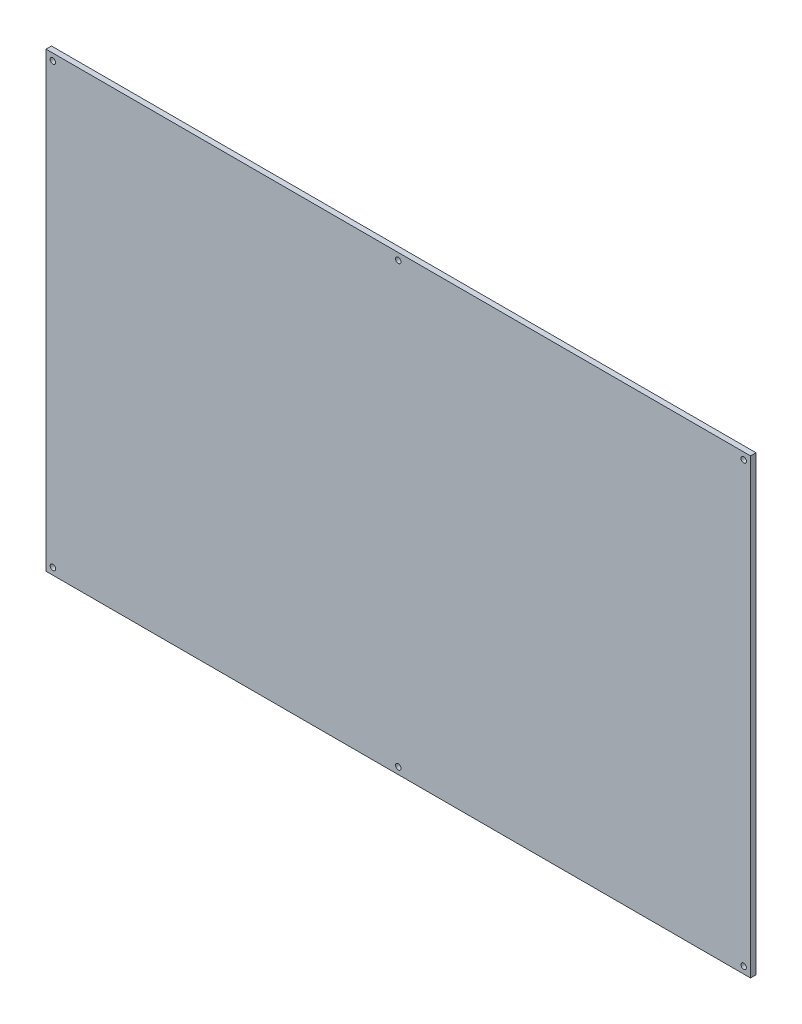
ISO-10303-21;
HEADER;
FILE_DESCRIPTION(('STEP AP214'),'2;1');
FILE_NAME('part.step','',(''),(''),'','','');
FILE_SCHEMA(('AUTOMOTIVE_DESIGN { 1 0 10303 214 1 1 1 1 }'));
ENDSEC;
DATA;
#1=APPLICATION_CONTEXT('core data for automotive mechanical design processes');
#2=APPLICATION_PROTOCOL_DEFINITION('international standard','automotive_design',2000,#1);
#3=PRODUCT_CONTEXT('',#1,'mechanical');
#4=PRODUCT('Part','Part','',(#3));
#5=PRODUCT_RELATED_PRODUCT_CATEGORY('part','',(#4));
#6=PRODUCT_DEFINITION_FORMATION('','',#4);
#7=PRODUCT_DEFINITION_CONTEXT('part definition',#1,'design');
#8=PRODUCT_DEFINITION('design','',#6,#7);
#9=PRODUCT_DEFINITION_SHAPE('','',#8);
#10=(LENGTH_UNIT() NAMED_UNIT(*) SI_UNIT(.MILLI.,.METRE.));
#11=(NAMED_UNIT(*) PLANE_ANGLE_UNIT() SI_UNIT($,.RADIAN.));
#12=(NAMED_UNIT(*) SI_UNIT($,.STERADIAN.) SOLID_ANGLE_UNIT());
#13=UNCERTAINTY_MEASURE_WITH_UNIT(LENGTH_MEASURE(1.E-05),#10,'distance_accuracy_value','');
#14=(GEOMETRIC_REPRESENTATION_CONTEXT(3) GLOBAL_UNCERTAINTY_ASSIGNED_CONTEXT((#13)) GLOBAL_UNIT_ASSIGNED_CONTEXT((#10,
#11,#12)) REPRESENTATION_CONTEXT('',''));
#15=CARTESIAN_POINT('',(0.,0.,0.));
#16=DIRECTION('',(0.,0.,1.));
#17=DIRECTION('',(1.,0.,0.));
#18=AXIS2_PLACEMENT_3D('',#15,#16,#17);
#19=CARTESIAN_POINT('',(0.,0.,2.));
#20=DIRECTION('',(0.,0.,1.));
#21=DIRECTION('',(1.,0.,0.));
#22=AXIS2_PLACEMENT_3D('',#19,#20,#21);
#23=PLANE('',#22);
#24=CARTESIAN_POINT('',(59.385498411727,-129.568493909192,2.));
#25=DIRECTION('',(0.,0.,1.));
#26=DIRECTION('',(1.,0.,0.));
#27=AXIS2_PLACEMENT_3D('',#24,#25,#26);
#28=CIRCLE('',#27,0.999999999999998);
#29=CARTESIAN_POINT('',(60.385498411727,-129.568493909192,2.));
#30=VERTEX_POINT('',#29);
#31=EDGE_CURVE('E132',#30,#30,#28,.T.);
#32=ORIENTED_EDGE('',*,*,#31,.F.);
#33=EDGE_LOOP('',(#32));
#34=FACE_BOUND('',#33,.T.);
#35=CARTESIAN_POINT('',(186.115498411727,31.3315060908084,2.));
#36=DIRECTION('',(0.,0.,1.));
#37=DIRECTION('',(1.,0.,0.));
#38=AXIS2_PLACEMENT_3D('',#35,#36,#37);
#39=CIRCLE('',#38,0.999999999999998);
#40=CARTESIAN_POINT('',(187.115498411727,31.3315060908084,2.));
#41=VERTEX_POINT('',#40);
#42=EDGE_CURVE('E120',#41,#41,#39,.T.);
#43=ORIENTED_EDGE('',*,*,#42,.F.);
#44=EDGE_LOOP('',(#43));
#45=FACE_BOUND('',#44,.T.);
#46=CARTESIAN_POINT('',(-67.334501588273,31.3315060908084,2.));
#47=DIRECTION('',(0.,0.,1.));
#48=DIRECTION('',(1.,0.,0.));
#49=AXIS2_PLACEMENT_3D('',#46,#47,#48);
#50=CIRCLE('',#49,0.999999999999998);
#51=CARTESIAN_POINT('',(-66.334501588273,31.3315060908084,2.));
#52=VERTEX_POINT('',#51);
#53=EDGE_CURVE('E99',#52,#52,#50,.T.);
#54=ORIENTED_EDGE('',*,*,#53,.F.);
#55=EDGE_LOOP('',(#54));
#56=FACE_BOUND('',#55,.T.);
#57=DIRECTION('',(0.,-1.,0.));
#58=VECTOR('',#57,1.);
#59=CARTESIAN_POINT('',(-69.834501588273,33.8315060908084,2.));
#60=LINE('',#59,#58);
#61=CARTESIAN_POINT('',(-69.834501588273,33.8315060908084,2.));
#62=VERTEX_POINT('',#61);
#63=CARTESIAN_POINT('',(-69.834501588273,-132.068493909192,2.));
#64=VERTEX_POINT('',#63);
#65=EDGE_CURVE('E84',#62,#64,#60,.T.);
#66=ORIENTED_EDGE('',*,*,#65,.T.);
#67=DIRECTION('',(1.,0.,0.));
#68=VECTOR('',#67,1.);
#69=CARTESIAN_POINT('',(-69.834501588273,-132.068493909192,2.));
#70=LINE('',#69,#68);
#71=CARTESIAN_POINT('',(188.615498411727,-132.068493909192,2.));
#72=VERTEX_POINT('',#71);
#73=EDGE_CURVE('E79',#64,#72,#70,.T.);
#74=ORIENTED_EDGE('',*,*,#73,.T.);
#75=DIRECTION('',(0.,1.,0.));
#76=VECTOR('',#75,1.);
#77=CARTESIAN_POINT('',(188.615498411727,33.8315060908084,2.));
#78=LINE('',#77,#76);
#79=CARTESIAN_POINT('',(188.615498411727,33.8315060908084,2.));
#80=VERTEX_POINT('',#79);
#81=EDGE_CURVE('E82',#72,#80,#78,.T.);
#82=ORIENTED_EDGE('',*,*,#81,.T.);
#83=DIRECTION('',(-1.,0.,0.));
#84=VECTOR('',#83,1.);
#85=CARTESIAN_POINT('',(-69.834501588273,33.8315060908084,2.));
#86=LINE('',#85,#84);
#87=EDGE_CURVE('E49',#80,#62,#86,.T.);
#88=ORIENTED_EDGE('',*,*,#87,.T.);
#89=EDGE_LOOP('',(#66,#74,#82,#88));
#90=FACE_BOUND('',#89,.T.);
#91=CARTESIAN_POINT('',(59.385498411727,31.3315060908084,2.));
#92=DIRECTION('',(0.,0.,1.));
#93=DIRECTION('',(1.,0.,0.));
#94=AXIS2_PLACEMENT_3D('',#91,#92,#93);
#95=CIRCLE('',#94,0.999999999999998);
#96=CARTESIAN_POINT('',(60.385498411727,31.3315060908084,2.));
#97=VERTEX_POINT('',#96);
#98=EDGE_CURVE('E114',#97,#97,#95,.T.);
#99=ORIENTED_EDGE('',*,*,#98,.F.);
#100=EDGE_LOOP('',(#99));
#101=FACE_BOUND('',#100,.T.);
#102=CARTESIAN_POINT('',(-67.334501588273,-129.568493909192,2.));
#103=DIRECTION('',(0.,0.,1.));
#104=DIRECTION('',(1.,0.,0.));
#105=AXIS2_PLACEMENT_3D('',#102,#103,#104);
#106=CIRCLE('',#105,0.999999999999998);
#107=CARTESIAN_POINT('',(-66.334501588273,-129.568493909192,2.));
#108=VERTEX_POINT('',#107);
#109=EDGE_CURVE('E126',#108,#108,#106,.T.);
#110=ORIENTED_EDGE('',*,*,#109,.F.);
#111=EDGE_LOOP('',(#110));
#112=FACE_BOUND('',#111,.T.);
#113=CARTESIAN_POINT('',(186.115498411727,-129.568493909192,2.));
#114=DIRECTION('',(0.,0.,1.));
#115=DIRECTION('',(1.,0.,0.));
#116=AXIS2_PLACEMENT_3D('',#113,#114,#115);
#117=CIRCLE('',#116,0.999999999999998);
#118=CARTESIAN_POINT('',(187.115498411727,-129.568493909192,2.));
#119=VERTEX_POINT('',#118);
#120=EDGE_CURVE('E138',#119,#119,#117,.T.);
#121=ORIENTED_EDGE('',*,*,#120,.F.);
#122=EDGE_LOOP('',(#121));
#123=FACE_BOUND('',#122,.T.);
#124=ADVANCED_FACE('F32',(#34,#45,#56,#90,#101,#112,#123),#23,.T.);
#125=CARTESIAN_POINT('',(0.,0.,0.));
#126=DIRECTION('',(0.,0.,1.));
#127=DIRECTION('',(1.,0.,0.));
#128=AXIS2_PLACEMENT_3D('',#125,#126,#127);
#129=PLANE('',#128);
#130=CARTESIAN_POINT('',(59.385498411727,-129.568493909192,0.));
#131=DIRECTION('',(0.,0.,1.));
#132=DIRECTION('',(1.,0.,0.));
#133=AXIS2_PLACEMENT_3D('',#130,#131,#132);
#134=CIRCLE('',#133,0.999999999999998);
#135=CARTESIAN_POINT('',(60.385498411727,-129.568493909192,0.));
#136=VERTEX_POINT('',#135);
#137=EDGE_CURVE('E135',#136,#136,#134,.T.);
#138=ORIENTED_EDGE('',*,*,#137,.T.);
#139=EDGE_LOOP('',(#138));
#140=FACE_BOUND('',#139,.T.);
#141=CARTESIAN_POINT('',(186.115498411727,31.3315060908084,0.));
#142=DIRECTION('',(0.,0.,1.));
#143=DIRECTION('',(1.,0.,0.));
#144=AXIS2_PLACEMENT_3D('',#141,#142,#143);
#145=CIRCLE('',#144,0.999999999999998);
#146=CARTESIAN_POINT('',(187.115498411727,31.3315060908084,0.));
#147=VERTEX_POINT('',#146);
#148=EDGE_CURVE('E123',#147,#147,#145,.T.);
#149=ORIENTED_EDGE('',*,*,#148,.T.);
#150=EDGE_LOOP('',(#149));
#151=FACE_BOUND('',#150,.T.);
#152=CARTESIAN_POINT('',(-67.334501588273,31.3315060908084,0.));
#153=DIRECTION('',(0.,0.,1.));
#154=DIRECTION('',(1.,0.,0.));
#155=AXIS2_PLACEMENT_3D('',#152,#153,#154);
#156=CIRCLE('',#155,0.999999999999998);
#157=CARTESIAN_POINT('',(-66.334501588273,31.3315060908084,0.));
#158=VERTEX_POINT('',#157);
#159=EDGE_CURVE('E111',#158,#158,#156,.T.);
#160=ORIENTED_EDGE('',*,*,#159,.T.);
#161=EDGE_LOOP('',(#160));
#162=FACE_BOUND('',#161,.T.);
#163=DIRECTION('',(0.,-1.,0.));
#164=VECTOR('',#163,1.);
#165=CARTESIAN_POINT('',(-69.834501588273,33.8315060908084,0.));
#166=LINE('',#165,#164);
#167=CARTESIAN_POINT('',(-69.834501588273,33.8315060908084,0.));
#168=VERTEX_POINT('',#167);
#169=CARTESIAN_POINT('',(-69.834501588273,-132.068493909192,0.));
#170=VERTEX_POINT('',#169);
#171=EDGE_CURVE('E96',#168,#170,#166,.T.);
#172=ORIENTED_EDGE('',*,*,#171,.F.);
#173=DIRECTION('',(-1.,0.,0.));
#174=VECTOR('',#173,1.);
#175=CARTESIAN_POINT('',(-69.834501588273,33.8315060908084,0.));
#176=LINE('',#175,#174);
#177=CARTESIAN_POINT('',(188.615498411727,33.8315060908084,0.));
#178=VERTEX_POINT('',#177);
#179=EDGE_CURVE('E72',#178,#168,#176,.T.);
#180=ORIENTED_EDGE('',*,*,#179,.F.);
#181=DIRECTION('',(0.,1.,0.));
#182=VECTOR('',#181,1.);
#183=CARTESIAN_POINT('',(188.615498411727,33.8315060908084,0.));
#184=LINE('',#183,#182);
#185=CARTESIAN_POINT('',(188.615498411727,-132.068493909192,0.));
#186=VERTEX_POINT('',#185);
#187=EDGE_CURVE('E66',#186,#178,#184,.T.);
#188=ORIENTED_EDGE('',*,*,#187,.F.);
#189=DIRECTION('',(1.,0.,0.));
#190=VECTOR('',#189,1.);
#191=CARTESIAN_POINT('',(-69.834501588273,-132.068493909192,0.));
#192=LINE('',#191,#190);
#193=EDGE_CURVE('E88',#170,#186,#192,.T.);
#194=ORIENTED_EDGE('',*,*,#193,.F.);
#195=EDGE_LOOP('',(#172,#180,#188,#194));
#196=FACE_BOUND('',#195,.T.);
#197=CARTESIAN_POINT('',(59.385498411727,31.3315060908084,0.));
#198=DIRECTION('',(0.,0.,1.));
#199=DIRECTION('',(1.,0.,0.));
#200=AXIS2_PLACEMENT_3D('',#197,#198,#199);
#201=CIRCLE('',#200,0.999999999999998);
#202=CARTESIAN_POINT('',(60.385498411727,31.3315060908084,0.));
#203=VERTEX_POINT('',#202);
#204=EDGE_CURVE('E117',#203,#203,#201,.T.);
#205=ORIENTED_EDGE('',*,*,#204,.T.);
#206=EDGE_LOOP('',(#205));
#207=FACE_BOUND('',#206,.T.);
#208=CARTESIAN_POINT('',(-67.334501588273,-129.568493909192,0.));
#209=DIRECTION('',(0.,0.,1.));
#210=DIRECTION('',(1.,0.,0.));
#211=AXIS2_PLACEMENT_3D('',#208,#209,#210);
#212=CIRCLE('',#211,0.999999999999998);
#213=CARTESIAN_POINT('',(-66.334501588273,-129.568493909192,0.));
#214=VERTEX_POINT('',#213);
#215=EDGE_CURVE('E129',#214,#214,#212,.T.);
#216=ORIENTED_EDGE('',*,*,#215,.T.);
#217=EDGE_LOOP('',(#216));
#218=FACE_BOUND('',#217,.T.);
#219=CARTESIAN_POINT('',(186.115498411727,-129.568493909192,0.));
#220=DIRECTION('',(0.,0.,1.));
#221=DIRECTION('',(1.,0.,0.));
#222=AXIS2_PLACEMENT_3D('',#219,#220,#221);
#223=CIRCLE('',#222,0.999999999999998);
#224=CARTESIAN_POINT('',(187.115498411727,-129.568493909192,0.));
#225=VERTEX_POINT('',#224);
#226=EDGE_CURVE('E141',#225,#225,#223,.T.);
#227=ORIENTED_EDGE('',*,*,#226,.T.);
#228=EDGE_LOOP('',(#227));
#229=FACE_BOUND('',#228,.T.);
#230=ADVANCED_FACE('F107',(#140,#151,#162,#196,#207,#218,#229),#129,.F.);
#231=CARTESIAN_POINT('',(-69.834501588273,33.8315060908084,2.));
#232=DIRECTION('',(1.,0.,0.));
#233=DIRECTION('',(0.,1.,0.));
#234=AXIS2_PLACEMENT_3D('',#231,#232,#233);
#235=PLANE('',#234);
#236=ORIENTED_EDGE('',*,*,#171,.T.);
#237=DIRECTION('',(0.,0.,-1.));
#238=VECTOR('',#237,1.);
#239=CARTESIAN_POINT('',(-69.834501588273,-132.068493909192,2.));
#240=LINE('',#239,#238);
#241=EDGE_CURVE('E11',#64,#170,#240,.T.);
#242=ORIENTED_EDGE('',*,*,#241,.F.);
#243=ORIENTED_EDGE('',*,*,#65,.F.);
#244=DIRECTION('',(0.,0.,-1.));
#245=VECTOR('',#244,1.);
#246=CARTESIAN_POINT('',(-69.834501588273,33.8315060908084,2.));
#247=LINE('',#246,#245);
#248=EDGE_CURVE('E92',#62,#168,#247,.T.);
#249=ORIENTED_EDGE('',*,*,#248,.T.);
#250=EDGE_LOOP('',(#236,#242,#243,#249));
#251=FACE_BOUND('',#250,.T.);
#252=ADVANCED_FACE('F34',(#251),#235,.F.);
#253=CARTESIAN_POINT('',(-69.834501588273,-132.068493909192,2.));
#254=DIRECTION('',(0.,1.,0.));
#255=DIRECTION('',(0.,0.,1.));
#256=AXIS2_PLACEMENT_3D('',#253,#254,#255);
#257=PLANE('',#256);
#258=ORIENTED_EDGE('',*,*,#193,.T.);
#259=DIRECTION('',(0.,0.,-1.));
#260=VECTOR('',#259,1.);
#261=CARTESIAN_POINT('',(188.615498411727,-132.068493909192,2.));
#262=LINE('',#261,#260);
#263=EDGE_CURVE('E41',#72,#186,#262,.T.);
#264=ORIENTED_EDGE('',*,*,#263,.F.);
#265=ORIENTED_EDGE('',*,*,#73,.F.);
#266=ORIENTED_EDGE('',*,*,#241,.T.);
#267=EDGE_LOOP('',(#258,#264,#265,#266));
#268=FACE_BOUND('',#267,.T.);
#269=ADVANCED_FACE('F87',(#268),#257,.F.);
#270=CARTESIAN_POINT('',(188.615498411727,33.8315060908084,2.));
#271=DIRECTION('',(-1.,0.,0.));
#272=DIRECTION('',(0.,-1.,0.));
#273=AXIS2_PLACEMENT_3D('',#270,#271,#272);
#274=PLANE('',#273);
#275=ORIENTED_EDGE('',*,*,#187,.T.);
#276=DIRECTION('',(0.,0.,-1.));
#277=VECTOR('',#276,1.);
#278=CARTESIAN_POINT('',(188.615498411727,33.8315060908084,2.));
#279=LINE('',#278,#277);
#280=EDGE_CURVE('E89',#80,#178,#279,.T.);
#281=ORIENTED_EDGE('',*,*,#280,.F.);
#282=ORIENTED_EDGE('',*,*,#81,.F.);
#283=ORIENTED_EDGE('',*,*,#263,.T.);
#284=EDGE_LOOP('',(#275,#281,#282,#283));
#285=FACE_BOUND('',#284,.T.);
#286=ADVANCED_FACE('F90',(#285),#274,.F.);
#287=CARTESIAN_POINT('',(-69.834501588273,33.8315060908084,2.));
#288=DIRECTION('',(0.,-1.,0.));
#289=DIRECTION('',(0.,0.,-1.));
#290=AXIS2_PLACEMENT_3D('',#287,#288,#289);
#291=PLANE('',#290);
#292=ORIENTED_EDGE('',*,*,#179,.T.);
#293=ORIENTED_EDGE('',*,*,#248,.F.);
#294=ORIENTED_EDGE('',*,*,#87,.F.);
#295=ORIENTED_EDGE('',*,*,#280,.T.);
#296=EDGE_LOOP('',(#292,#293,#294,#295));
#297=FACE_BOUND('',#296,.T.);
#298=ADVANCED_FACE('F104',(#297),#291,.F.);
#299=CARTESIAN_POINT('',(-67.334501588273,31.3315060908084,2.));
#300=DIRECTION('',(0.,0.,-1.));
#301=DIRECTION('',(-1.,0.,0.));
#302=AXIS2_PLACEMENT_3D('',#299,#300,#301);
#303=CYLINDRICAL_SURFACE('',#302,0.999999999999998);
#304=ORIENTED_EDGE('',*,*,#53,.T.);
#305=EDGE_LOOP('',(#304));
#306=FACE_BOUND('',#305,.T.);
#307=ORIENTED_EDGE('',*,*,#159,.F.);
#308=EDGE_LOOP('',(#307));
#309=FACE_BOUND('',#308,.T.);
#310=ADVANCED_FACE('F161',(#306,#309),#303,.F.);
#311=CARTESIAN_POINT('',(59.385498411727,31.3315060908084,2.));
#312=DIRECTION('',(0.,0.,-1.));
#313=DIRECTION('',(-1.,0.,0.));
#314=AXIS2_PLACEMENT_3D('',#311,#312,#313);
#315=CYLINDRICAL_SURFACE('',#314,0.999999999999998);
#316=ORIENTED_EDGE('',*,*,#98,.T.);
#317=EDGE_LOOP('',(#316));
#318=FACE_BOUND('',#317,.T.);
#319=ORIENTED_EDGE('',*,*,#204,.F.);
#320=EDGE_LOOP('',(#319));
#321=FACE_BOUND('',#320,.T.);
#322=ADVANCED_FACE('F207',(#318,#321),#315,.F.);
#323=CARTESIAN_POINT('',(186.115498411727,31.3315060908084,2.));
#324=DIRECTION('',(0.,0.,-1.));
#325=DIRECTION('',(-1.,0.,0.));
#326=AXIS2_PLACEMENT_3D('',#323,#324,#325);
#327=CYLINDRICAL_SURFACE('',#326,0.999999999999998);
#328=ORIENTED_EDGE('',*,*,#42,.T.);
#329=EDGE_LOOP('',(#328));
#330=FACE_BOUND('',#329,.T.);
#331=ORIENTED_EDGE('',*,*,#148,.F.);
#332=EDGE_LOOP('',(#331));
#333=FACE_BOUND('',#332,.T.);
#334=ADVANCED_FACE('F215',(#330,#333),#327,.F.);
#335=CARTESIAN_POINT('',(-67.334501588273,-129.568493909192,2.));
#336=DIRECTION('',(0.,0.,-1.));
#337=DIRECTION('',(-1.,0.,0.));
#338=AXIS2_PLACEMENT_3D('',#335,#336,#337);
#339=CYLINDRICAL_SURFACE('',#338,0.999999999999998);
#340=ORIENTED_EDGE('',*,*,#109,.T.);
#341=EDGE_LOOP('',(#340));
#342=FACE_BOUND('',#341,.T.);
#343=ORIENTED_EDGE('',*,*,#215,.F.);
#344=EDGE_LOOP('',(#343));
#345=FACE_BOUND('',#344,.T.);
#346=ADVANCED_FACE('F223',(#342,#345),#339,.F.);
#347=CARTESIAN_POINT('',(59.385498411727,-129.568493909192,2.));
#348=DIRECTION('',(0.,0.,-1.));
#349=DIRECTION('',(-1.,0.,0.));
#350=AXIS2_PLACEMENT_3D('',#347,#348,#349);
#351=CYLINDRICAL_SURFACE('',#350,0.999999999999998);
#352=ORIENTED_EDGE('',*,*,#31,.T.);
#353=EDGE_LOOP('',(#352));
#354=FACE_BOUND('',#353,.T.);
#355=ORIENTED_EDGE('',*,*,#137,.F.);
#356=EDGE_LOOP('',(#355));
#357=FACE_BOUND('',#356,.T.);
#358=ADVANCED_FACE('F232',(#354,#357),#351,.F.);
#359=CARTESIAN_POINT('',(186.115498411727,-129.568493909192,2.));
#360=DIRECTION('',(0.,0.,-1.));
#361=DIRECTION('',(-1.,0.,0.));
#362=AXIS2_PLACEMENT_3D('',#359,#360,#361);
#363=CYLINDRICAL_SURFACE('',#362,0.999999999999998);
#364=ORIENTED_EDGE('',*,*,#120,.T.);
#365=EDGE_LOOP('',(#364));
#366=FACE_BOUND('',#365,.T.);
#367=ORIENTED_EDGE('',*,*,#226,.F.);
#368=EDGE_LOOP('',(#367));
#369=FACE_BOUND('',#368,.T.);
#370=ADVANCED_FACE('F147',(#366,#369),#363,.F.);
#371=CLOSED_SHELL('',(#124,#230,#252,#269,#286,#298,#310,#322,#334,#346,#358,#370));
#372=MANIFOLD_SOLID_BREP('B2',#371);
#373=ADVANCED_BREP_SHAPE_REPRESENTATION('',(#18,#372),#14);
#374=SHAPE_DEFINITION_REPRESENTATION(#9,#373);
ENDSEC;
END-ISO-10303-21;
